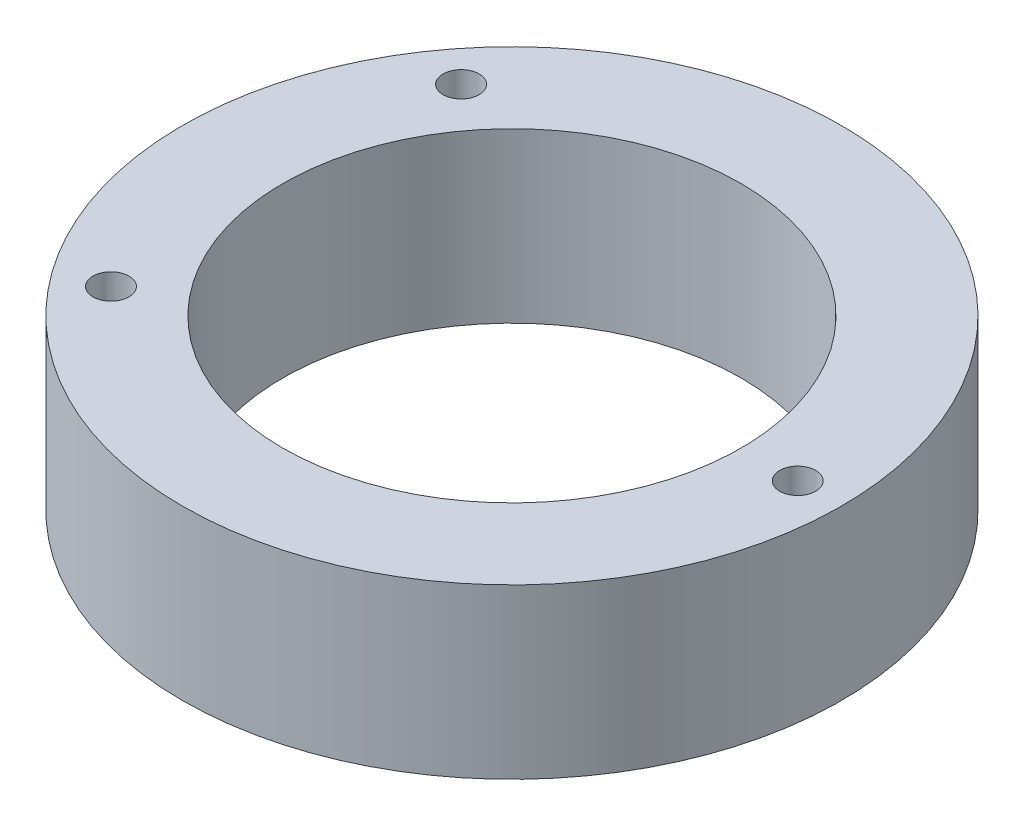
ISO-10303-21;
HEADER;
FILE_DESCRIPTION(('STEP AP214'),'2;1');
FILE_NAME('part.step','',(''),(''),'','','');
FILE_SCHEMA(('AUTOMOTIVE_DESIGN { 1 0 10303 214 1 1 1 1 }'));
ENDSEC;
DATA;
#1=APPLICATION_CONTEXT('core data for automotive mechanical design processes');
#2=APPLICATION_PROTOCOL_DEFINITION('international standard','automotive_design',2000,#1);
#3=PRODUCT_CONTEXT('',#1,'mechanical');
#4=PRODUCT('Part','Part','',(#3));
#5=PRODUCT_RELATED_PRODUCT_CATEGORY('part','',(#4));
#6=PRODUCT_DEFINITION_FORMATION('','',#4);
#7=PRODUCT_DEFINITION_CONTEXT('part definition',#1,'design');
#8=PRODUCT_DEFINITION('design','',#6,#7);
#9=PRODUCT_DEFINITION_SHAPE('','',#8);
#10=(LENGTH_UNIT() NAMED_UNIT(*) SI_UNIT(.MILLI.,.METRE.));
#11=(NAMED_UNIT(*) PLANE_ANGLE_UNIT() SI_UNIT($,.RADIAN.));
#12=(NAMED_UNIT(*) SI_UNIT($,.STERADIAN.) SOLID_ANGLE_UNIT());
#13=UNCERTAINTY_MEASURE_WITH_UNIT(LENGTH_MEASURE(1.E-05),#10,'distance_accuracy_value','');
#14=(GEOMETRIC_REPRESENTATION_CONTEXT(3) GLOBAL_UNCERTAINTY_ASSIGNED_CONTEXT((#13)) GLOBAL_UNIT_ASSIGNED_CONTEXT((#10,
#11,#12)) REPRESENTATION_CONTEXT('',''));
#15=CARTESIAN_POINT('',(0.,0.,0.));
#16=DIRECTION('',(0.,0.,1.));
#17=DIRECTION('',(1.,0.,0.));
#18=AXIS2_PLACEMENT_3D('',#15,#16,#17);
#19=CARTESIAN_POINT('',(0.,16.35,0.));
#20=DIRECTION('',(0.,1.,0.));
#21=DIRECTION('',(0.,0.,1.));
#22=AXIS2_PLACEMENT_3D('',#19,#20,#21);
#23=PLANE('',#22);
#24=CARTESIAN_POINT('',(-21.9327372290304,16.35,17.0005158051838));
#25=DIRECTION('',(0.,1.,0.));
#26=DIRECTION('',(0.,0.,1.));
#27=AXIS2_PLACEMENT_3D('',#24,#25,#26);
#28=CIRCLE('',#27,1.75);
#29=CARTESIAN_POINT('',(-21.9327372290304,16.35,18.7505158051838));
#30=VERTEX_POINT('',#29);
#31=EDGE_CURVE('E52',#30,#30,#28,.T.);
#32=ORIENTED_EDGE('',*,*,#31,.F.);
#33=EDGE_LOOP('',(#32));
#34=FACE_BOUND('',#33,.T.);
#35=CARTESIAN_POINT('',(0.,16.35,0.));
#36=DIRECTION('',(0.,1.,0.));
#37=DIRECTION('',(0.,0.,1.));
#38=AXIS2_PLACEMENT_3D('',#35,#36,#37);
#39=CIRCLE('',#38,22.25);
#40=CARTESIAN_POINT('',(0.,16.35,22.25));
#41=VERTEX_POINT('',#40);
#42=EDGE_CURVE('E41',#41,#41,#39,.T.);
#43=ORIENTED_EDGE('',*,*,#42,.F.);
#44=EDGE_LOOP('',(#43));
#45=FACE_BOUND('',#44,.T.);
#46=CARTESIAN_POINT('',(0.,16.35,0.));
#47=DIRECTION('',(0.,1.,0.));
#48=DIRECTION('',(0.,0.,1.));
#49=AXIS2_PLACEMENT_3D('',#46,#47,#48);
#50=CIRCLE('',#49,32.);
#51=CARTESIAN_POINT('',(0.,16.35,32.));
#52=VERTEX_POINT('',#51);
#53=EDGE_CURVE('E10',#52,#52,#50,.T.);
#54=ORIENTED_EDGE('',*,*,#53,.T.);
#55=EDGE_LOOP('',(#54));
#56=FACE_BOUND('',#55,.T.);
#57=CARTESIAN_POINT('',(-21.9327372290304,16.35,-17.0005158051838));
#58=DIRECTION('',(0.,1.,0.));
#59=DIRECTION('',(0.,0.,1.));
#60=AXIS2_PLACEMENT_3D('',#57,#58,#59);
#61=CIRCLE('',#60,1.75);
#62=CARTESIAN_POINT('',(-21.9327372290304,16.35,-15.2505158051838));
#63=VERTEX_POINT('',#62);
#64=EDGE_CURVE('E46',#63,#63,#61,.T.);
#65=ORIENTED_EDGE('',*,*,#64,.F.);
#66=EDGE_LOOP('',(#65));
#67=FACE_BOUND('',#66,.T.);
#68=CARTESIAN_POINT('',(27.75,16.35,0.));
#69=DIRECTION('',(0.,1.,0.));
#70=DIRECTION('',(0.,0.,1.));
#71=AXIS2_PLACEMENT_3D('',#68,#69,#70);
#72=CIRCLE('',#71,1.75);
#73=CARTESIAN_POINT('',(27.75,16.35,1.75));
#74=VERTEX_POINT('',#73);
#75=EDGE_CURVE('E58',#74,#74,#72,.T.);
#76=ORIENTED_EDGE('',*,*,#75,.F.);
#77=EDGE_LOOP('',(#76));
#78=FACE_BOUND('',#77,.T.);
#79=ADVANCED_FACE('F30',(#34,#45,#56,#67,#78),#23,.T.);
#80=CARTESIAN_POINT('',(0.,0.,0.));
#81=DIRECTION('',(0.,1.,0.));
#82=DIRECTION('',(0.,0.,1.));
#83=AXIS2_PLACEMENT_3D('',#80,#81,#82);
#84=PLANE('',#83);
#85=CARTESIAN_POINT('',(0.,0.,0.));
#86=DIRECTION('',(0.,1.,0.));
#87=DIRECTION('',(0.,0.,1.));
#88=AXIS2_PLACEMENT_3D('',#85,#86,#87);
#89=CIRCLE('',#88,32.);
#90=CARTESIAN_POINT('',(0.,0.,32.));
#91=VERTEX_POINT('',#90);
#92=EDGE_CURVE('E34',#91,#91,#89,.T.);
#93=ORIENTED_EDGE('',*,*,#92,.F.);
#94=EDGE_LOOP('',(#93));
#95=FACE_BOUND('',#94,.T.);
#96=CARTESIAN_POINT('',(0.,0.,0.));
#97=DIRECTION('',(0.,1.,0.));
#98=DIRECTION('',(0.,0.,1.));
#99=AXIS2_PLACEMENT_3D('',#96,#97,#98);
#100=CIRCLE('',#99,22.25);
#101=CARTESIAN_POINT('',(0.,0.,22.25));
#102=VERTEX_POINT('',#101);
#103=EDGE_CURVE('E43',#102,#102,#100,.T.);
#104=ORIENTED_EDGE('',*,*,#103,.T.);
#105=EDGE_LOOP('',(#104));
#106=FACE_BOUND('',#105,.T.);
#107=CARTESIAN_POINT('',(-21.9327372290304,0.,-17.0005158051838));
#108=DIRECTION('',(0.,1.,0.));
#109=DIRECTION('',(0.,0.,1.));
#110=AXIS2_PLACEMENT_3D('',#107,#108,#109);
#111=CIRCLE('',#110,1.75);
#112=CARTESIAN_POINT('',(-21.9327372290304,0.,-15.2505158051838));
#113=VERTEX_POINT('',#112);
#114=EDGE_CURVE('E49',#113,#113,#111,.T.);
#115=ORIENTED_EDGE('',*,*,#114,.T.);
#116=EDGE_LOOP('',(#115));
#117=FACE_BOUND('',#116,.T.);
#118=CARTESIAN_POINT('',(-21.9327372290304,0.,17.0005158051838));
#119=DIRECTION('',(0.,1.,0.));
#120=DIRECTION('',(0.,0.,1.));
#121=AXIS2_PLACEMENT_3D('',#118,#119,#120);
#122=CIRCLE('',#121,1.75);
#123=CARTESIAN_POINT('',(-21.9327372290304,0.,18.7505158051838));
#124=VERTEX_POINT('',#123);
#125=EDGE_CURVE('E55',#124,#124,#122,.T.);
#126=ORIENTED_EDGE('',*,*,#125,.T.);
#127=EDGE_LOOP('',(#126));
#128=FACE_BOUND('',#127,.T.);
#129=CARTESIAN_POINT('',(27.75,0.,0.));
#130=DIRECTION('',(0.,1.,0.));
#131=DIRECTION('',(0.,0.,1.));
#132=AXIS2_PLACEMENT_3D('',#129,#130,#131);
#133=CIRCLE('',#132,1.75);
#134=CARTESIAN_POINT('',(27.75,0.,1.75));
#135=VERTEX_POINT('',#134);
#136=EDGE_CURVE('E61',#135,#135,#133,.T.);
#137=ORIENTED_EDGE('',*,*,#136,.T.);
#138=EDGE_LOOP('',(#137));
#139=FACE_BOUND('',#138,.T.);
#140=ADVANCED_FACE('F71',(#95,#106,#117,#128,#139),#84,.F.);
#141=CARTESIAN_POINT('',(0.,16.35,0.));
#142=DIRECTION('',(0.,-1.,0.));
#143=DIRECTION('',(0.,0.,-1.));
#144=AXIS2_PLACEMENT_3D('',#141,#142,#143);
#145=CYLINDRICAL_SURFACE('',#144,32.);
#146=ORIENTED_EDGE('',*,*,#53,.F.);
#147=EDGE_LOOP('',(#146));
#148=FACE_BOUND('',#147,.T.);
#149=ORIENTED_EDGE('',*,*,#92,.T.);
#150=EDGE_LOOP('',(#149));
#151=FACE_BOUND('',#150,.T.);
#152=ADVANCED_FACE('F32',(#148,#151),#145,.T.);
#153=CARTESIAN_POINT('',(0.,16.35,0.));
#154=DIRECTION('',(0.,-1.,0.));
#155=DIRECTION('',(0.,0.,-1.));
#156=AXIS2_PLACEMENT_3D('',#153,#154,#155);
#157=CYLINDRICAL_SURFACE('',#156,22.25);
#158=ORIENTED_EDGE('',*,*,#42,.T.);
#159=EDGE_LOOP('',(#158));
#160=FACE_BOUND('',#159,.T.);
#161=ORIENTED_EDGE('',*,*,#103,.F.);
#162=EDGE_LOOP('',(#161));
#163=FACE_BOUND('',#162,.T.);
#164=ADVANCED_FACE('F81',(#160,#163),#157,.F.);
#165=CARTESIAN_POINT('',(-21.9327372290304,16.35,-17.0005158051838));
#166=DIRECTION('',(0.,-1.,0.));
#167=DIRECTION('',(0.,0.,-1.));
#168=AXIS2_PLACEMENT_3D('',#165,#166,#167);
#169=CYLINDRICAL_SURFACE('',#168,1.75);
#170=ORIENTED_EDGE('',*,*,#64,.T.);
#171=EDGE_LOOP('',(#170));
#172=FACE_BOUND('',#171,.T.);
#173=ORIENTED_EDGE('',*,*,#114,.F.);
#174=EDGE_LOOP('',(#173));
#175=FACE_BOUND('',#174,.T.);
#176=ADVANCED_FACE('F84',(#172,#175),#169,.F.);
#177=CARTESIAN_POINT('',(-21.9327372290304,16.35,17.0005158051838));
#178=DIRECTION('',(0.,-1.,0.));
#179=DIRECTION('',(0.,0.,-1.));
#180=AXIS2_PLACEMENT_3D('',#177,#178,#179);
#181=CYLINDRICAL_SURFACE('',#180,1.75);
#182=ORIENTED_EDGE('',*,*,#31,.T.);
#183=EDGE_LOOP('',(#182));
#184=FACE_BOUND('',#183,.T.);
#185=ORIENTED_EDGE('',*,*,#125,.F.);
#186=EDGE_LOOP('',(#185));
#187=FACE_BOUND('',#186,.T.);
#188=ADVANCED_FACE('F88',(#184,#187),#181,.F.);
#189=CARTESIAN_POINT('',(27.75,16.35,0.));
#190=DIRECTION('',(0.,-1.,0.));
#191=DIRECTION('',(0.,0.,-1.));
#192=AXIS2_PLACEMENT_3D('',#189,#190,#191);
#193=CYLINDRICAL_SURFACE('',#192,1.75);
#194=ORIENTED_EDGE('',*,*,#75,.T.);
#195=EDGE_LOOP('',(#194));
#196=FACE_BOUND('',#195,.T.);
#197=ORIENTED_EDGE('',*,*,#136,.F.);
#198=EDGE_LOOP('',(#197));
#199=FACE_BOUND('',#198,.T.);
#200=ADVANCED_FACE('F67',(#196,#199),#193,.F.);
#201=CLOSED_SHELL('',(#79,#140,#152,#164,#176,#188,#200));
#202=MANIFOLD_SOLID_BREP('B2',#201);
#203=ADVANCED_BREP_SHAPE_REPRESENTATION('',(#18,#202),#14);
#204=SHAPE_DEFINITION_REPRESENTATION(#9,#203);
ENDSEC;
END-ISO-10303-21;
